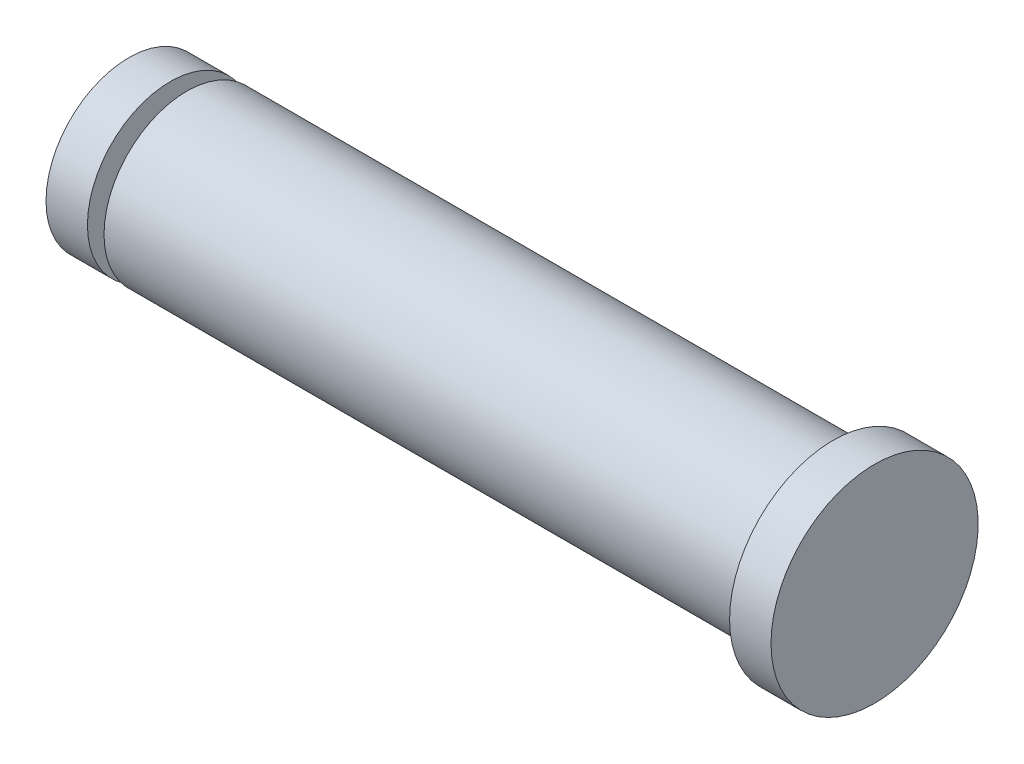
ISO-10303-21;
HEADER;
FILE_DESCRIPTION(('STEP AP214'),'2;1');
FILE_NAME('part.step','',(''),(''),'','','');
FILE_SCHEMA(('AUTOMOTIVE_DESIGN { 1 0 10303 214 1 1 1 1 }'));
ENDSEC;
DATA;
#1=APPLICATION_CONTEXT('core data for automotive mechanical design processes');
#2=APPLICATION_PROTOCOL_DEFINITION('international standard','automotive_design',2000,#1);
#3=PRODUCT_CONTEXT('',#1,'mechanical');
#4=PRODUCT('Part','Part','',(#3));
#5=PRODUCT_RELATED_PRODUCT_CATEGORY('part','',(#4));
#6=PRODUCT_DEFINITION_FORMATION('','',#4);
#7=PRODUCT_DEFINITION_CONTEXT('part definition',#1,'design');
#8=PRODUCT_DEFINITION('design','',#6,#7);
#9=PRODUCT_DEFINITION_SHAPE('','',#8);
#10=(LENGTH_UNIT() NAMED_UNIT(*) SI_UNIT(.MILLI.,.METRE.));
#11=(NAMED_UNIT(*) PLANE_ANGLE_UNIT() SI_UNIT($,.RADIAN.));
#12=(NAMED_UNIT(*) SI_UNIT($,.STERADIAN.) SOLID_ANGLE_UNIT());
#13=UNCERTAINTY_MEASURE_WITH_UNIT(LENGTH_MEASURE(1.E-05),#10,'distance_accuracy_value','');
#14=(GEOMETRIC_REPRESENTATION_CONTEXT(3) GLOBAL_UNCERTAINTY_ASSIGNED_CONTEXT((#13)) GLOBAL_UNIT_ASSIGNED_CONTEXT((#10,
#11,#12)) REPRESENTATION_CONTEXT('',''));
#15=CARTESIAN_POINT('',(0.,0.,0.));
#16=DIRECTION('',(0.,0.,1.));
#17=DIRECTION('',(1.,0.,0.));
#18=AXIS2_PLACEMENT_3D('',#15,#16,#17);
#19=CARTESIAN_POINT('',(0.,30.,0.));
#20=DIRECTION('',(1.,0.,0.));
#21=DIRECTION('',(0.,0.,-1.));
#22=AXIS2_PLACEMENT_3D('',#19,#20,#21);
#23=PLANE('',#22);
#24=CARTESIAN_POINT('',(0.,0.,0.));
#25=DIRECTION('',(-1.,0.,0.));
#26=DIRECTION('',(0.,0.,1.));
#27=AXIS2_PLACEMENT_3D('',#24,#25,#26);
#28=CIRCLE('',#27,30.);
#29=CARTESIAN_POINT('',(0.,0.,30.));
#30=VERTEX_POINT('',#29);
#31=EDGE_CURVE('E58',#30,#30,#28,.T.);
#32=ORIENTED_EDGE('',*,*,#31,.T.);
#33=EDGE_LOOP('',(#32));
#34=FACE_BOUND('',#33,.T.);
#35=ADVANCED_FACE('F30',(#34),#23,.F.);
#36=CARTESIAN_POINT('',(270.,37.5,0.));
#37=DIRECTION('',(-1.,0.,0.));
#38=DIRECTION('',(0.,0.,1.));
#39=AXIS2_PLACEMENT_3D('',#36,#37,#38);
#40=PLANE('',#39);
#41=CARTESIAN_POINT('',(270.,0.,0.));
#42=DIRECTION('',(-1.,0.,0.));
#43=DIRECTION('',(0.,0.,1.));
#44=AXIS2_PLACEMENT_3D('',#41,#42,#43);
#45=CIRCLE('',#44,37.5);
#46=CARTESIAN_POINT('',(270.,0.,37.5));
#47=VERTEX_POINT('',#46);
#48=EDGE_CURVE('E10',#47,#47,#45,.T.);
#49=ORIENTED_EDGE('',*,*,#48,.F.);
#50=EDGE_LOOP('',(#49));
#51=FACE_BOUND('',#50,.T.);
#52=ADVANCED_FACE('F100',(#51),#40,.F.);
#53=CARTESIAN_POINT('',(0.,0.,0.));
#54=DIRECTION('',(-1.,0.,0.));
#55=DIRECTION('',(0.,0.,1.));
#56=AXIS2_PLACEMENT_3D('',#53,#54,#55);
#57=CYLINDRICAL_SURFACE('',#56,37.5);
#58=CARTESIAN_POINT('',(255.,0.,0.));
#59=DIRECTION('',(-1.,0.,0.));
#60=DIRECTION('',(0.,0.,1.));
#61=AXIS2_PLACEMENT_3D('',#58,#59,#60);
#62=CIRCLE('',#61,37.5);
#63=CARTESIAN_POINT('',(255.,0.,37.5));
#64=VERTEX_POINT('',#63);
#65=EDGE_CURVE('E36',#64,#64,#62,.T.);
#66=ORIENTED_EDGE('',*,*,#65,.F.);
#67=EDGE_LOOP('',(#66));
#68=FACE_BOUND('',#67,.T.);
#69=ORIENTED_EDGE('',*,*,#48,.T.);
#70=EDGE_LOOP('',(#69));
#71=FACE_BOUND('',#70,.T.);
#72=ADVANCED_FACE('F95',(#68,#71),#57,.T.);
#73=CARTESIAN_POINT('',(255.,30.,0.));
#74=DIRECTION('',(1.,0.,0.));
#75=DIRECTION('',(0.,0.,-1.));
#76=AXIS2_PLACEMENT_3D('',#73,#74,#75);
#77=PLANE('',#76);
#78=CARTESIAN_POINT('',(255.,0.,0.));
#79=DIRECTION('',(-1.,0.,0.));
#80=DIRECTION('',(0.,0.,1.));
#81=AXIS2_PLACEMENT_3D('',#78,#79,#80);
#82=CIRCLE('',#81,30.);
#83=CARTESIAN_POINT('',(255.,0.,30.));
#84=VERTEX_POINT('',#83);
#85=EDGE_CURVE('E40',#84,#84,#82,.T.);
#86=ORIENTED_EDGE('',*,*,#85,.F.);
#87=EDGE_LOOP('',(#86));
#88=FACE_BOUND('',#87,.T.);
#89=ORIENTED_EDGE('',*,*,#65,.T.);
#90=EDGE_LOOP('',(#89));
#91=FACE_BOUND('',#90,.T.);
#92=ADVANCED_FACE('F90',(#88,#91),#77,.F.);
#93=CARTESIAN_POINT('',(0.,0.,0.));
#94=DIRECTION('',(-1.,0.,0.));
#95=DIRECTION('',(0.,0.,1.));
#96=AXIS2_PLACEMENT_3D('',#93,#94,#95);
#97=CYLINDRICAL_SURFACE('',#96,30.);
#98=CARTESIAN_POINT('',(21.,0.,0.));
#99=DIRECTION('',(-1.,0.,0.));
#100=DIRECTION('',(0.,0.,1.));
#101=AXIS2_PLACEMENT_3D('',#98,#99,#100);
#102=CIRCLE('',#101,30.);
#103=CARTESIAN_POINT('',(21.,0.,30.));
#104=VERTEX_POINT('',#103);
#105=EDGE_CURVE('E44',#104,#104,#102,.T.);
#106=ORIENTED_EDGE('',*,*,#105,.F.);
#107=EDGE_LOOP('',(#106));
#108=FACE_BOUND('',#107,.T.);
#109=ORIENTED_EDGE('',*,*,#85,.T.);
#110=EDGE_LOOP('',(#109));
#111=FACE_BOUND('',#110,.T.);
#112=ADVANCED_FACE('F84',(#108,#111),#97,.T.);
#113=CARTESIAN_POINT('',(21.,30.,0.));
#114=DIRECTION('',(1.,0.,0.));
#115=DIRECTION('',(0.,0.,-1.));
#116=AXIS2_PLACEMENT_3D('',#113,#114,#115);
#117=PLANE('',#116);
#118=CARTESIAN_POINT('',(21.,0.,0.));
#119=DIRECTION('',(-1.,0.,0.));
#120=DIRECTION('',(0.,0.,1.));
#121=AXIS2_PLACEMENT_3D('',#118,#119,#120);
#122=CIRCLE('',#121,20.);
#123=CARTESIAN_POINT('',(21.,0.,20.));
#124=VERTEX_POINT('',#123);
#125=EDGE_CURVE('E49',#124,#124,#122,.T.);
#126=ORIENTED_EDGE('',*,*,#125,.F.);
#127=EDGE_LOOP('',(#126));
#128=FACE_BOUND('',#127,.T.);
#129=ORIENTED_EDGE('',*,*,#105,.T.);
#130=EDGE_LOOP('',(#129));
#131=FACE_BOUND('',#130,.T.);
#132=ADVANCED_FACE('F78',(#128,#131),#117,.F.);
#133=CARTESIAN_POINT('',(0.,0.,0.));
#134=DIRECTION('',(-1.,0.,0.));
#135=DIRECTION('',(0.,0.,1.));
#136=AXIS2_PLACEMENT_3D('',#133,#134,#135);
#137=CYLINDRICAL_SURFACE('',#136,20.);
#138=CARTESIAN_POINT('',(15.,0.,0.));
#139=DIRECTION('',(-1.,0.,0.));
#140=DIRECTION('',(0.,0.,1.));
#141=AXIS2_PLACEMENT_3D('',#138,#139,#140);
#142=CIRCLE('',#141,20.);
#143=CARTESIAN_POINT('',(15.,0.,20.));
#144=VERTEX_POINT('',#143);
#145=EDGE_CURVE('E52',#144,#144,#142,.T.);
#146=ORIENTED_EDGE('',*,*,#145,.F.);
#147=EDGE_LOOP('',(#146));
#148=FACE_BOUND('',#147,.T.);
#149=ORIENTED_EDGE('',*,*,#125,.T.);
#150=EDGE_LOOP('',(#149));
#151=FACE_BOUND('',#150,.T.);
#152=ADVANCED_FACE('F72',(#148,#151),#137,.T.);
#153=CARTESIAN_POINT('',(15.,20.,0.));
#154=DIRECTION('',(-1.,0.,0.));
#155=DIRECTION('',(0.,0.,1.));
#156=AXIS2_PLACEMENT_3D('',#153,#154,#155);
#157=PLANE('',#156);
#158=CARTESIAN_POINT('',(15.,0.,0.));
#159=DIRECTION('',(-1.,0.,0.));
#160=DIRECTION('',(0.,0.,1.));
#161=AXIS2_PLACEMENT_3D('',#158,#159,#160);
#162=CIRCLE('',#161,30.);
#163=CARTESIAN_POINT('',(15.,0.,30.));
#164=VERTEX_POINT('',#163);
#165=EDGE_CURVE('E55',#164,#164,#162,.T.);
#166=ORIENTED_EDGE('',*,*,#165,.F.);
#167=EDGE_LOOP('',(#166));
#168=FACE_BOUND('',#167,.T.);
#169=ORIENTED_EDGE('',*,*,#145,.T.);
#170=EDGE_LOOP('',(#169));
#171=FACE_BOUND('',#170,.T.);
#172=ADVANCED_FACE('F66',(#168,#171),#157,.F.);
#173=CARTESIAN_POINT('',(0.,0.,0.));
#174=DIRECTION('',(-1.,0.,0.));
#175=DIRECTION('',(0.,0.,1.));
#176=AXIS2_PLACEMENT_3D('',#173,#174,#175);
#177=CYLINDRICAL_SURFACE('',#176,30.);
#178=ORIENTED_EDGE('',*,*,#31,.F.);
#179=EDGE_LOOP('',(#178));
#180=FACE_BOUND('',#179,.T.);
#181=ORIENTED_EDGE('',*,*,#165,.T.);
#182=EDGE_LOOP('',(#181));
#183=FACE_BOUND('',#182,.T.);
#184=ADVANCED_FACE('F63',(#180,#183),#177,.T.);
#185=CLOSED_SHELL('',(#35,#52,#72,#92,#112,#132,#152,#172,#184));
#186=MANIFOLD_SOLID_BREP('B2',#185);
#187=ADVANCED_BREP_SHAPE_REPRESENTATION('',(#18,#186),#14);
#188=SHAPE_DEFINITION_REPRESENTATION(#9,#187);
ENDSEC;
END-ISO-10303-21;
